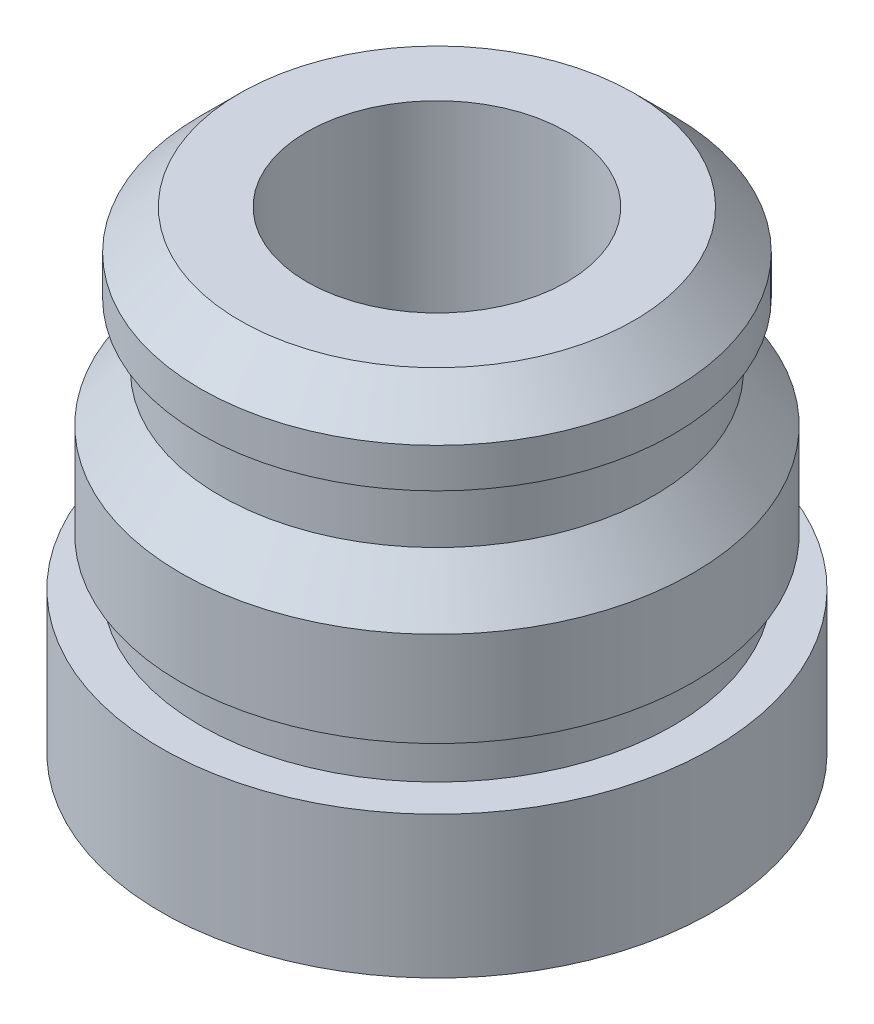
ISO-10303-21;
HEADER;
FILE_DESCRIPTION(('STEP AP214'),'2;1');
FILE_NAME('part.step','',(''),(''),'','','');
FILE_SCHEMA(('AUTOMOTIVE_DESIGN { 1 0 10303 214 1 1 1 1 }'));
ENDSEC;
DATA;
#1=APPLICATION_CONTEXT('core data for automotive mechanical design processes');
#2=APPLICATION_PROTOCOL_DEFINITION('international standard','automotive_design',2000,#1);
#3=PRODUCT_CONTEXT('',#1,'mechanical');
#4=PRODUCT('Part','Part','',(#3));
#5=PRODUCT_RELATED_PRODUCT_CATEGORY('part','',(#4));
#6=PRODUCT_DEFINITION_FORMATION('','',#4);
#7=PRODUCT_DEFINITION_CONTEXT('part definition',#1,'design');
#8=PRODUCT_DEFINITION('design','',#6,#7);
#9=PRODUCT_DEFINITION_SHAPE('','',#8);
#10=(LENGTH_UNIT() NAMED_UNIT(*) SI_UNIT(.MILLI.,.METRE.));
#11=(NAMED_UNIT(*) PLANE_ANGLE_UNIT() SI_UNIT($,.RADIAN.));
#12=(NAMED_UNIT(*) SI_UNIT($,.STERADIAN.) SOLID_ANGLE_UNIT());
#13=UNCERTAINTY_MEASURE_WITH_UNIT(LENGTH_MEASURE(1.E-05),#10,'distance_accuracy_value','');
#14=(GEOMETRIC_REPRESENTATION_CONTEXT(3) GLOBAL_UNCERTAINTY_ASSIGNED_CONTEXT((#13)) GLOBAL_UNIT_ASSIGNED_CONTEXT((#10,
#11,#12)) REPRESENTATION_CONTEXT('',''));
#15=CARTESIAN_POINT('',(0.,0.,0.));
#16=DIRECTION('',(0.,0.,1.));
#17=DIRECTION('',(1.,0.,0.));
#18=AXIS2_PLACEMENT_3D('',#15,#16,#17);
#19=CARTESIAN_POINT('',(1.5,-0.122080905212553,0.));
#20=DIRECTION('',(0.,-1.,0.));
#21=DIRECTION('',(0.,0.,-1.));
#22=AXIS2_PLACEMENT_3D('',#19,#20,#21);
#23=PLANE('',#22);
#24=CARTESIAN_POINT('',(0.,-0.122080905212554,0.));
#25=DIRECTION('',(0.,-1.,0.));
#26=DIRECTION('',(0.,0.,-1.));
#27=AXIS2_PLACEMENT_3D('',#24,#25,#26);
#28=CIRCLE('',#27,1.64999999999999);
#29=CARTESIAN_POINT('',(0.,-0.122080905212554,-1.64999999999999));
#30=VERTEX_POINT('',#29);
#31=EDGE_CURVE('E76',#30,#30,#28,.T.);
#32=ORIENTED_EDGE('',*,*,#31,.F.);
#33=EDGE_LOOP('',(#32));
#34=FACE_BOUND('',#33,.T.);
#35=CARTESIAN_POINT('',(0.,-0.122080905212553,0.));
#36=DIRECTION('',(0.,-1.,0.));
#37=DIRECTION('',(0.,0.,-1.));
#38=AXIS2_PLACEMENT_3D('',#35,#36,#37);
#39=CIRCLE('',#38,3.5);
#40=CARTESIAN_POINT('',(0.,-0.122080905212553,-3.5));
#41=VERTEX_POINT('',#40);
#42=EDGE_CURVE('E10',#41,#41,#39,.T.);
#43=ORIENTED_EDGE('',*,*,#42,.T.);
#44=EDGE_LOOP('',(#43));
#45=FACE_BOUND('',#44,.T.);
#46=ADVANCED_FACE('F33',(#34,#45),#23,.T.);
#47=CARTESIAN_POINT('',(0.,0.,0.));
#48=DIRECTION('',(0.,-1.,0.));
#49=DIRECTION('',(0.,0.,-1.));
#50=AXIS2_PLACEMENT_3D('',#47,#48,#49);
#51=CYLINDRICAL_SURFACE('',#50,3.5);
#52=CARTESIAN_POINT('',(0.,1.67791909478745,0.));
#53=DIRECTION('',(0.,-1.,0.));
#54=DIRECTION('',(0.,0.,-1.));
#55=AXIS2_PLACEMENT_3D('',#52,#53,#54);
#56=CIRCLE('',#55,3.5);
#57=CARTESIAN_POINT('',(0.,1.67791909478745,-3.5));
#58=VERTEX_POINT('',#57);
#59=EDGE_CURVE('E39',#58,#58,#56,.T.);
#60=ORIENTED_EDGE('',*,*,#59,.T.);
#61=EDGE_LOOP('',(#60));
#62=FACE_BOUND('',#61,.T.);
#63=ORIENTED_EDGE('',*,*,#42,.F.);
#64=EDGE_LOOP('',(#63));
#65=FACE_BOUND('',#64,.T.);
#66=ADVANCED_FACE('F83',(#62,#65),#51,.T.);
#67=CARTESIAN_POINT('',(3.5,1.67791909478745,0.));
#68=DIRECTION('',(0.,1.,0.));
#69=DIRECTION('',(0.,0.,1.));
#70=AXIS2_PLACEMENT_3D('',#67,#68,#69);
#71=PLANE('',#70);
#72=CARTESIAN_POINT('',(0.,1.67791909478745,0.));
#73=DIRECTION('',(0.,-1.,0.));
#74=DIRECTION('',(0.,0.,-1.));
#75=AXIS2_PLACEMENT_3D('',#72,#73,#74);
#76=CIRCLE('',#75,3.);
#77=CARTESIAN_POINT('',(0.,1.67791909478745,-3.));
#78=VERTEX_POINT('',#77);
#79=EDGE_CURVE('E43',#78,#78,#76,.T.);
#80=ORIENTED_EDGE('',*,*,#79,.T.);
#81=EDGE_LOOP('',(#80));
#82=FACE_BOUND('',#81,.T.);
#83=ORIENTED_EDGE('',*,*,#59,.F.);
#84=EDGE_LOOP('',(#83));
#85=FACE_BOUND('',#84,.T.);
#86=ADVANCED_FACE('F87',(#82,#85),#71,.T.);
#87=CARTESIAN_POINT('',(0.,0.,0.));
#88=DIRECTION('',(0.,-1.,0.));
#89=DIRECTION('',(0.,0.,-1.));
#90=AXIS2_PLACEMENT_3D('',#87,#88,#89);
#91=CYLINDRICAL_SURFACE('',#90,3.);
#92=CARTESIAN_POINT('',(0.,2.27791909478745,0.));
#93=DIRECTION('',(0.,-1.,0.));
#94=DIRECTION('',(0.,0.,-1.));
#95=AXIS2_PLACEMENT_3D('',#92,#93,#94);
#96=CIRCLE('',#95,3.);
#97=CARTESIAN_POINT('',(0.,2.27791909478745,-3.));
#98=VERTEX_POINT('',#97);
#99=EDGE_CURVE('E47',#98,#98,#96,.T.);
#100=ORIENTED_EDGE('',*,*,#99,.T.);
#101=EDGE_LOOP('',(#100));
#102=FACE_BOUND('',#101,.T.);
#103=ORIENTED_EDGE('',*,*,#79,.F.);
#104=EDGE_LOOP('',(#103));
#105=FACE_BOUND('',#104,.T.);
#106=ADVANCED_FACE('F91',(#102,#105),#91,.T.);
#107=CARTESIAN_POINT('',(3.,2.27791909478745,0.));
#108=DIRECTION('',(0.,-1.,0.));
#109=DIRECTION('',(0.,0.,-1.));
#110=AXIS2_PLACEMENT_3D('',#107,#108,#109);
#111=PLANE('',#110);
#112=CARTESIAN_POINT('',(0.,2.27791909478745,0.));
#113=DIRECTION('',(0.,-1.,0.));
#114=DIRECTION('',(0.,0.,-1.));
#115=AXIS2_PLACEMENT_3D('',#112,#113,#114);
#116=CIRCLE('',#115,3.25);
#117=CARTESIAN_POINT('',(0.,2.27791909478745,-3.25));
#118=VERTEX_POINT('',#117);
#119=EDGE_CURVE('E52',#118,#118,#116,.T.);
#120=ORIENTED_EDGE('',*,*,#119,.T.);
#121=EDGE_LOOP('',(#120));
#122=FACE_BOUND('',#121,.T.);
#123=ORIENTED_EDGE('',*,*,#99,.F.);
#124=EDGE_LOOP('',(#123));
#125=FACE_BOUND('',#124,.T.);
#126=ADVANCED_FACE('F98',(#122,#125),#111,.T.);
#127=CARTESIAN_POINT('',(0.,0.,0.));
#128=DIRECTION('',(0.,-1.,0.));
#129=DIRECTION('',(0.,0.,-1.));
#130=AXIS2_PLACEMENT_3D('',#127,#128,#129);
#131=CYLINDRICAL_SURFACE('',#130,3.25);
#132=CARTESIAN_POINT('',(0.,3.47791909478745,0.));
#133=DIRECTION('',(0.,-1.,0.));
#134=DIRECTION('',(0.,0.,-1.));
#135=AXIS2_PLACEMENT_3D('',#132,#133,#134);
#136=CIRCLE('',#135,3.25);
#137=CARTESIAN_POINT('',(0.,3.47791909478745,-3.25));
#138=VERTEX_POINT('',#137);
#139=EDGE_CURVE('E55',#138,#138,#136,.T.);
#140=ORIENTED_EDGE('',*,*,#139,.T.);
#141=EDGE_LOOP('',(#140));
#142=FACE_BOUND('',#141,.T.);
#143=ORIENTED_EDGE('',*,*,#119,.F.);
#144=EDGE_LOOP('',(#143));
#145=FACE_BOUND('',#144,.T.);
#146=ADVANCED_FACE('F102',(#142,#145),#131,.T.);
#147=CARTESIAN_POINT('',(0.,3.47791909478745,0.));
#148=DIRECTION('',(0.,-1.,0.));
#149=DIRECTION('',(0.,0.,-1.));
#150=AXIS2_PLACEMENT_3D('',#147,#148,#149);
#151=CONICAL_SURFACE('',#150,3.25,0.694738276196703);
#152=CARTESIAN_POINT('',(0.,4.07791909478745,0.));
#153=DIRECTION('',(0.,-1.,0.));
#154=DIRECTION('',(0.,0.,-1.));
#155=AXIS2_PLACEMENT_3D('',#152,#153,#154);
#156=CIRCLE('',#155,2.75);
#157=CARTESIAN_POINT('',(0.,4.07791909478745,-2.75));
#158=VERTEX_POINT('',#157);
#159=EDGE_CURVE('E58',#158,#158,#156,.T.);
#160=ORIENTED_EDGE('',*,*,#159,.T.);
#161=EDGE_LOOP('',(#160));
#162=FACE_BOUND('',#161,.T.);
#163=ORIENTED_EDGE('',*,*,#139,.F.);
#164=EDGE_LOOP('',(#163));
#165=FACE_BOUND('',#164,.T.);
#166=ADVANCED_FACE('F106',(#162,#165),#151,.T.);
#167=CARTESIAN_POINT('',(0.,0.,0.));
#168=DIRECTION('',(0.,-1.,0.));
#169=DIRECTION('',(0.,0.,-1.));
#170=AXIS2_PLACEMENT_3D('',#167,#168,#169);
#171=CYLINDRICAL_SURFACE('',#170,2.75);
#172=CARTESIAN_POINT('',(0.,4.87791909478745,0.));
#173=DIRECTION('',(0.,-1.,0.));
#174=DIRECTION('',(0.,0.,-1.));
#175=AXIS2_PLACEMENT_3D('',#172,#173,#174);
#176=CIRCLE('',#175,2.75);
#177=CARTESIAN_POINT('',(0.,4.87791909478745,-2.75));
#178=VERTEX_POINT('',#177);
#179=EDGE_CURVE('E61',#178,#178,#176,.T.);
#180=ORIENTED_EDGE('',*,*,#179,.T.);
#181=EDGE_LOOP('',(#180));
#182=FACE_BOUND('',#181,.T.);
#183=ORIENTED_EDGE('',*,*,#159,.F.);
#184=EDGE_LOOP('',(#183));
#185=FACE_BOUND('',#184,.T.);
#186=ADVANCED_FACE('F110',(#182,#185),#171,.T.);
#187=CARTESIAN_POINT('',(2.75,4.87791909478745,0.));
#188=DIRECTION('',(0.,-1.,0.));
#189=DIRECTION('',(0.,0.,-1.));
#190=AXIS2_PLACEMENT_3D('',#187,#188,#189);
#191=PLANE('',#190);
#192=CARTESIAN_POINT('',(0.,4.87791909478745,0.));
#193=DIRECTION('',(0.,-1.,0.));
#194=DIRECTION('',(0.,0.,-1.));
#195=AXIS2_PLACEMENT_3D('',#192,#193,#194);
#196=CIRCLE('',#195,3.);
#197=CARTESIAN_POINT('',(0.,4.87791909478745,-3.));
#198=VERTEX_POINT('',#197);
#199=EDGE_CURVE('E64',#198,#198,#196,.T.);
#200=ORIENTED_EDGE('',*,*,#199,.T.);
#201=EDGE_LOOP('',(#200));
#202=FACE_BOUND('',#201,.T.);
#203=ORIENTED_EDGE('',*,*,#179,.F.);
#204=EDGE_LOOP('',(#203));
#205=FACE_BOUND('',#204,.T.);
#206=ADVANCED_FACE('F114',(#202,#205),#191,.T.);
#207=CARTESIAN_POINT('',(0.,0.,0.));
#208=DIRECTION('',(0.,-1.,0.));
#209=DIRECTION('',(0.,0.,-1.));
#210=AXIS2_PLACEMENT_3D('',#207,#208,#209);
#211=CYLINDRICAL_SURFACE('',#210,3.);
#212=CARTESIAN_POINT('',(0.,5.37791909478745,0.));
#213=DIRECTION('',(0.,-1.,0.));
#214=DIRECTION('',(0.,0.,-1.));
#215=AXIS2_PLACEMENT_3D('',#212,#213,#214);
#216=CIRCLE('',#215,3.);
#217=CARTESIAN_POINT('',(0.,5.37791909478745,-3.));
#218=VERTEX_POINT('',#217);
#219=EDGE_CURVE('E67',#218,#218,#216,.T.);
#220=ORIENTED_EDGE('',*,*,#219,.T.);
#221=EDGE_LOOP('',(#220));
#222=FACE_BOUND('',#221,.T.);
#223=ORIENTED_EDGE('',*,*,#199,.F.);
#224=EDGE_LOOP('',(#223));
#225=FACE_BOUND('',#224,.T.);
#226=ADVANCED_FACE('F118',(#222,#225),#211,.T.);
#227=CARTESIAN_POINT('',(0.,5.37791909478745,0.));
#228=DIRECTION('',(0.,-1.,0.));
#229=DIRECTION('',(0.,0.,-1.));
#230=AXIS2_PLACEMENT_3D('',#227,#228,#229);
#231=CONICAL_SURFACE('',#230,3.,0.78539816339745);
#232=CARTESIAN_POINT('',(0.,5.87791909478745,0.));
#233=DIRECTION('',(0.,-1.,0.));
#234=DIRECTION('',(0.,0.,-1.));
#235=AXIS2_PLACEMENT_3D('',#232,#233,#234);
#236=CIRCLE('',#235,2.5);
#237=CARTESIAN_POINT('',(0.,5.87791909478745,-2.5));
#238=VERTEX_POINT('',#237);
#239=EDGE_CURVE('E70',#238,#238,#236,.T.);
#240=ORIENTED_EDGE('',*,*,#239,.T.);
#241=EDGE_LOOP('',(#240));
#242=FACE_BOUND('',#241,.T.);
#243=ORIENTED_EDGE('',*,*,#219,.F.);
#244=EDGE_LOOP('',(#243));
#245=FACE_BOUND('',#244,.T.);
#246=ADVANCED_FACE('F122',(#242,#245),#231,.T.);
#247=CARTESIAN_POINT('',(2.5,5.87791909478745,0.));
#248=DIRECTION('',(0.,1.,0.));
#249=DIRECTION('',(0.,0.,1.));
#250=AXIS2_PLACEMENT_3D('',#247,#248,#249);
#251=PLANE('',#250);
#252=CARTESIAN_POINT('',(0.,5.87791909478745,0.));
#253=DIRECTION('',(0.,-1.,0.));
#254=DIRECTION('',(0.,0.,-1.));
#255=AXIS2_PLACEMENT_3D('',#252,#253,#254);
#256=CIRCLE('',#255,1.65);
#257=CARTESIAN_POINT('',(0.,5.87791909478745,-1.65));
#258=VERTEX_POINT('',#257);
#259=EDGE_CURVE('E73',#258,#258,#256,.T.);
#260=ORIENTED_EDGE('',*,*,#259,.T.);
#261=EDGE_LOOP('',(#260));
#262=FACE_BOUND('',#261,.T.);
#263=ORIENTED_EDGE('',*,*,#239,.F.);
#264=EDGE_LOOP('',(#263));
#265=FACE_BOUND('',#264,.T.);
#266=ADVANCED_FACE('F126',(#262,#265),#251,.T.);
#267=CARTESIAN_POINT('',(0.,-0.122080905212553,0.));
#268=DIRECTION('',(0.,-1.,0.));
#269=DIRECTION('',(0.,0.,-1.));
#270=AXIS2_PLACEMENT_3D('',#267,#268,#269);
#271=CYLINDRICAL_SURFACE('',#270,1.64999999999999);
#272=ORIENTED_EDGE('',*,*,#259,.F.);
#273=EDGE_LOOP('',(#272));
#274=FACE_BOUND('',#273,.T.);
#275=ORIENTED_EDGE('',*,*,#31,.T.);
#276=EDGE_LOOP('',(#275));
#277=FACE_BOUND('',#276,.T.);
#278=ADVANCED_FACE('F80',(#274,#277),#271,.F.);
#279=CLOSED_SHELL('',(#46,#66,#86,#106,#126,#146,#166,#186,#206,#226,#246,#266,#278));
#280=MANIFOLD_SOLID_BREP('B2',#279);
#281=ADVANCED_BREP_SHAPE_REPRESENTATION('',(#18,#280),#14);
#282=SHAPE_DEFINITION_REPRESENTATION(#9,#281);
ENDSEC;
END-ISO-10303-21;
